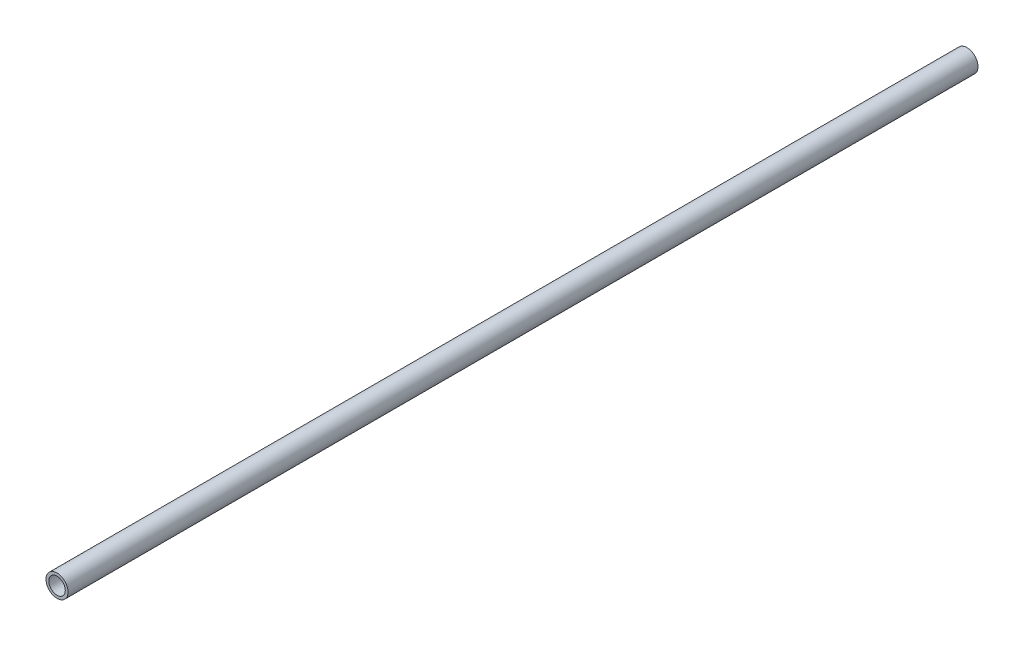
ISO-10303-21;
HEADER;
FILE_DESCRIPTION(('STEP AP214'),'2;1');
FILE_NAME('part.step','',(''),(''),'','','');
FILE_SCHEMA(('AUTOMOTIVE_DESIGN { 1 0 10303 214 1 1 1 1 }'));
ENDSEC;
DATA;
#1=APPLICATION_CONTEXT('core data for automotive mechanical design processes');
#2=APPLICATION_PROTOCOL_DEFINITION('international standard','automotive_design',2000,#1);
#3=PRODUCT_CONTEXT('',#1,'mechanical');
#4=PRODUCT('Part','Part','',(#3));
#5=PRODUCT_RELATED_PRODUCT_CATEGORY('part','',(#4));
#6=PRODUCT_DEFINITION_FORMATION('','',#4);
#7=PRODUCT_DEFINITION_CONTEXT('part definition',#1,'design');
#8=PRODUCT_DEFINITION('design','',#6,#7);
#9=PRODUCT_DEFINITION_SHAPE('','',#8);
#10=(LENGTH_UNIT() NAMED_UNIT(*) SI_UNIT(.MILLI.,.METRE.));
#11=(NAMED_UNIT(*) PLANE_ANGLE_UNIT() SI_UNIT($,.RADIAN.));
#12=(NAMED_UNIT(*) SI_UNIT($,.STERADIAN.) SOLID_ANGLE_UNIT());
#13=UNCERTAINTY_MEASURE_WITH_UNIT(LENGTH_MEASURE(1.E-05),#10,'distance_accuracy_value','');
#14=(GEOMETRIC_REPRESENTATION_CONTEXT(3) GLOBAL_UNCERTAINTY_ASSIGNED_CONTEXT((#13)) GLOBAL_UNIT_ASSIGNED_CONTEXT((#10,
#11,#12)) REPRESENTATION_CONTEXT('',''));
#15=CARTESIAN_POINT('',(0.,0.,0.));
#16=DIRECTION('',(0.,0.,1.));
#17=DIRECTION('',(1.,0.,0.));
#18=AXIS2_PLACEMENT_3D('',#15,#16,#17);
#19=CARTESIAN_POINT('',(0.,0.,330.));
#20=DIRECTION('',(0.,0.,1.));
#21=DIRECTION('',(1.,0.,0.));
#22=AXIS2_PLACEMENT_3D('',#19,#20,#21);
#23=PLANE('',#22);
#24=CARTESIAN_POINT('',(0.,0.,330.));
#25=DIRECTION('',(0.,0.,1.));
#26=DIRECTION('',(1.,0.,0.));
#27=AXIS2_PLACEMENT_3D('',#24,#25,#26);
#28=CIRCLE('',#27,4.);
#29=CARTESIAN_POINT('',(4.,0.,330.));
#30=VERTEX_POINT('',#29);
#31=EDGE_CURVE('E10',#30,#30,#28,.T.);
#32=ORIENTED_EDGE('',*,*,#31,.T.);
#33=EDGE_LOOP('',(#32));
#34=FACE_BOUND('',#33,.T.);
#35=CARTESIAN_POINT('',(0.,0.,330.));
#36=DIRECTION('',(0.,0.,1.));
#37=DIRECTION('',(1.,0.,0.));
#38=AXIS2_PLACEMENT_3D('',#35,#36,#37);
#39=CIRCLE('',#38,3.);
#40=CARTESIAN_POINT('',(3.,0.,330.));
#41=VERTEX_POINT('',#40);
#42=EDGE_CURVE('E43',#41,#41,#39,.T.);
#43=ORIENTED_EDGE('',*,*,#42,.F.);
#44=EDGE_LOOP('',(#43));
#45=FACE_BOUND('',#44,.T.);
#46=ADVANCED_FACE('F32',(#34,#45),#23,.T.);
#47=CARTESIAN_POINT('',(0.,0.,0.));
#48=DIRECTION('',(0.,0.,1.));
#49=DIRECTION('',(1.,0.,0.));
#50=AXIS2_PLACEMENT_3D('',#47,#48,#49);
#51=PLANE('',#50);
#52=CARTESIAN_POINT('',(0.,0.,0.));
#53=DIRECTION('',(0.,0.,1.));
#54=DIRECTION('',(1.,0.,0.));
#55=AXIS2_PLACEMENT_3D('',#52,#53,#54);
#56=CIRCLE('',#55,4.);
#57=CARTESIAN_POINT('',(4.,0.,0.));
#58=VERTEX_POINT('',#57);
#59=EDGE_CURVE('E36',#58,#58,#56,.T.);
#60=ORIENTED_EDGE('',*,*,#59,.F.);
#61=EDGE_LOOP('',(#60));
#62=FACE_BOUND('',#61,.T.);
#63=CARTESIAN_POINT('',(0.,0.,0.));
#64=DIRECTION('',(0.,0.,1.));
#65=DIRECTION('',(1.,0.,0.));
#66=AXIS2_PLACEMENT_3D('',#63,#64,#65);
#67=CIRCLE('',#66,3.);
#68=CARTESIAN_POINT('',(3.,0.,0.));
#69=VERTEX_POINT('',#68);
#70=EDGE_CURVE('E45',#69,#69,#67,.T.);
#71=ORIENTED_EDGE('',*,*,#70,.T.);
#72=EDGE_LOOP('',(#71));
#73=FACE_BOUND('',#72,.T.);
#74=ADVANCED_FACE('F55',(#62,#73),#51,.F.);
#75=CARTESIAN_POINT('',(0.,0.,330.));
#76=DIRECTION('',(0.,0.,-1.));
#77=DIRECTION('',(-1.,0.,0.));
#78=AXIS2_PLACEMENT_3D('',#75,#76,#77);
#79=CYLINDRICAL_SURFACE('',#78,4.);
#80=ORIENTED_EDGE('',*,*,#31,.F.);
#81=EDGE_LOOP('',(#80));
#82=FACE_BOUND('',#81,.T.);
#83=ORIENTED_EDGE('',*,*,#59,.T.);
#84=EDGE_LOOP('',(#83));
#85=FACE_BOUND('',#84,.T.);
#86=ADVANCED_FACE('F34',(#82,#85),#79,.T.);
#87=CARTESIAN_POINT('',(0.,0.,330.));
#88=DIRECTION('',(0.,0.,-1.));
#89=DIRECTION('',(-1.,0.,0.));
#90=AXIS2_PLACEMENT_3D('',#87,#88,#89);
#91=CYLINDRICAL_SURFACE('',#90,3.);
#92=ORIENTED_EDGE('',*,*,#42,.T.);
#93=EDGE_LOOP('',(#92));
#94=FACE_BOUND('',#93,.T.);
#95=ORIENTED_EDGE('',*,*,#70,.F.);
#96=EDGE_LOOP('',(#95));
#97=FACE_BOUND('',#96,.T.);
#98=ADVANCED_FACE('F51',(#94,#97),#91,.F.);
#99=CLOSED_SHELL('',(#46,#74,#86,#98));
#100=MANIFOLD_SOLID_BREP('B2',#99);
#101=ADVANCED_BREP_SHAPE_REPRESENTATION('',(#18,#100),#14);
#102=SHAPE_DEFINITION_REPRESENTATION(#9,#101);
ENDSEC;
END-ISO-10303-21;
